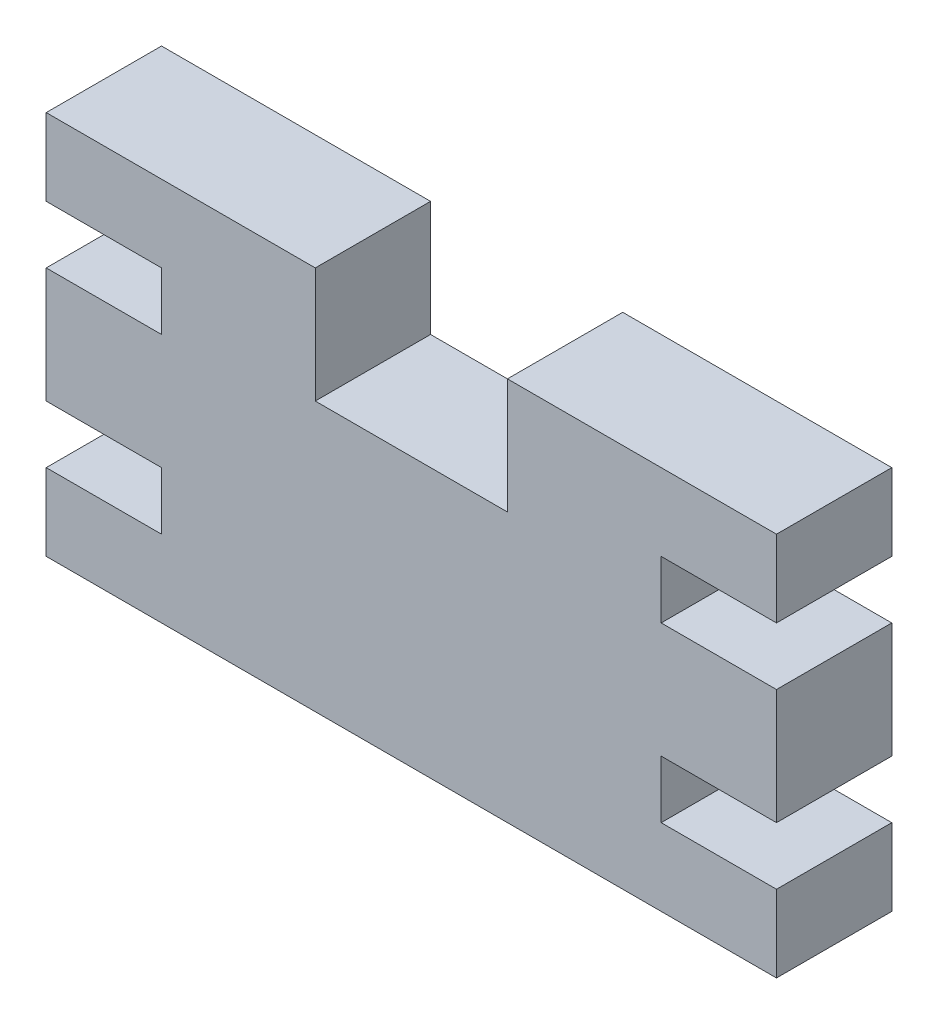
ISO-10303-21;
HEADER;
FILE_DESCRIPTION(('STEP AP214'),'2;1');
FILE_NAME('part.step','',(''),(''),'','','');
FILE_SCHEMA(('AUTOMOTIVE_DESIGN { 1 0 10303 214 1 1 1 1 }'));
ENDSEC;
DATA;
#1=APPLICATION_CONTEXT('core data for automotive mechanical design processes');
#2=APPLICATION_PROTOCOL_DEFINITION('international standard','automotive_design',2000,#1);
#3=PRODUCT_CONTEXT('',#1,'mechanical');
#4=PRODUCT('Part','Part','',(#3));
#5=PRODUCT_RELATED_PRODUCT_CATEGORY('part','',(#4));
#6=PRODUCT_DEFINITION_FORMATION('','',#4);
#7=PRODUCT_DEFINITION_CONTEXT('part definition',#1,'design');
#8=PRODUCT_DEFINITION('design','',#6,#7);
#9=PRODUCT_DEFINITION_SHAPE('','',#8);
#10=(LENGTH_UNIT() NAMED_UNIT(*) SI_UNIT(.MILLI.,.METRE.));
#11=(NAMED_UNIT(*) PLANE_ANGLE_UNIT() SI_UNIT($,.RADIAN.));
#12=(NAMED_UNIT(*) SI_UNIT($,.STERADIAN.) SOLID_ANGLE_UNIT());
#13=UNCERTAINTY_MEASURE_WITH_UNIT(LENGTH_MEASURE(1.E-05),#10,'distance_accuracy_value','');
#14=(GEOMETRIC_REPRESENTATION_CONTEXT(3) GLOBAL_UNCERTAINTY_ASSIGNED_CONTEXT((#13)) GLOBAL_UNIT_ASSIGNED_CONTEXT((#10,
#11,#12)) REPRESENTATION_CONTEXT('',''));
#15=CARTESIAN_POINT('',(0.,0.,0.));
#16=DIRECTION('',(0.,0.,1.));
#17=DIRECTION('',(1.,0.,0.));
#18=AXIS2_PLACEMENT_3D('',#15,#16,#17);
#19=CARTESIAN_POINT('',(12.5,14.6334586466165,3.));
#20=DIRECTION('',(0.,-1.,0.));
#21=DIRECTION('',(0.,0.,-1.));
#22=AXIS2_PLACEMENT_3D('',#19,#20,#21);
#23=PLANE('',#22);
#24=DIRECTION('',(-1.,0.,0.));
#25=VECTOR('',#24,1.);
#26=CARTESIAN_POINT('',(12.5,14.6334586466165,3.));
#27=LINE('',#26,#25);
#28=CARTESIAN_POINT('',(0.499999999999999,14.6334586466165,3.));
#29=VERTEX_POINT('',#28);
#30=CARTESIAN_POINT('',(-6.5,14.6334586466165,3.));
#31=VERTEX_POINT('',#30);
#32=EDGE_CURVE('E349',#29,#31,#27,.T.);
#33=ORIENTED_EDGE('',*,*,#32,.F.);
#34=DIRECTION('',(0.,0.,1.));
#35=VECTOR('',#34,1.);
#36=CARTESIAN_POINT('',(0.499999999999999,14.6334586466165,0.));
#37=LINE('',#36,#35);
#38=CARTESIAN_POINT('',(0.499999999999999,14.6334586466165,0.));
#39=VERTEX_POINT('',#38);
#40=EDGE_CURVE('E229',#39,#29,#37,.T.);
#41=ORIENTED_EDGE('',*,*,#40,.F.);
#42=DIRECTION('',(-1.,0.,0.));
#43=VECTOR('',#42,1.);
#44=CARTESIAN_POINT('',(12.5,14.6334586466165,0.));
#45=LINE('',#44,#43);
#46=CARTESIAN_POINT('',(-6.5,14.6334586466165,0.));
#47=VERTEX_POINT('',#46);
#48=EDGE_CURVE('E220',#39,#47,#45,.T.);
#49=ORIENTED_EDGE('',*,*,#48,.T.);
#50=DIRECTION('',(0.,0.,-1.));
#51=VECTOR('',#50,1.);
#52=CARTESIAN_POINT('',(-6.5,14.6334586466165,3.));
#53=LINE('',#52,#51);
#54=EDGE_CURVE('E354',#31,#47,#53,.T.);
#55=ORIENTED_EDGE('',*,*,#54,.F.);
#56=EDGE_LOOP('',(#33,#41,#49,#55));
#57=FACE_BOUND('',#56,.T.);
#58=ADVANCED_FACE('F39',(#57),#23,.F.);
#59=CARTESIAN_POINT('',(12.5,4.63345864661654,3.));
#60=DIRECTION('',(-1.,0.,0.));
#61=DIRECTION('',(0.,-1.,0.));
#62=AXIS2_PLACEMENT_3D('',#59,#60,#61);
#63=PLANE('',#62);
#64=DIRECTION('',(0.,1.,0.));
#65=VECTOR('',#64,1.);
#66=CARTESIAN_POINT('',(12.5,4.63345864661654,0.));
#67=LINE('',#66,#65);
#68=CARTESIAN_POINT('',(12.5,8.13345864661654,0.));
#69=VERTEX_POINT('',#68);
#70=CARTESIAN_POINT('',(12.5,11.1334586466165,0.));
#71=VERTEX_POINT('',#70);
#72=EDGE_CURVE('E365',#69,#71,#67,.T.);
#73=ORIENTED_EDGE('',*,*,#72,.T.);
#74=DIRECTION('',(0.,0.,1.));
#75=VECTOR('',#74,1.);
#76=CARTESIAN_POINT('',(12.5,11.1334586466165,0.));
#77=LINE('',#76,#75);
#78=CARTESIAN_POINT('',(12.5,11.1334586466165,3.));
#79=VERTEX_POINT('',#78);
#80=EDGE_CURVE('E253',#71,#79,#77,.T.);
#81=ORIENTED_EDGE('',*,*,#80,.T.);
#82=DIRECTION('',(0.,1.,0.));
#83=VECTOR('',#82,1.);
#84=CARTESIAN_POINT('',(12.5,4.63345864661654,3.));
#85=LINE('',#84,#83);
#86=CARTESIAN_POINT('',(12.5,8.13345864661654,3.));
#87=VERTEX_POINT('',#86);
#88=EDGE_CURVE('E350',#87,#79,#85,.T.);
#89=ORIENTED_EDGE('',*,*,#88,.F.);
#90=DIRECTION('',(0.,0.,1.));
#91=VECTOR('',#90,1.);
#92=CARTESIAN_POINT('',(12.5,8.13345864661654,0.));
#93=LINE('',#92,#91);
#94=EDGE_CURVE('E262',#69,#87,#93,.T.);
#95=ORIENTED_EDGE('',*,*,#94,.F.);
#96=EDGE_LOOP('',(#73,#81,#89,#95));
#97=FACE_BOUND('',#96,.T.);
#98=ADVANCED_FACE('F438',(#97),#63,.F.);
#99=CARTESIAN_POINT('',(12.5,4.63345864661654,0.));
#100=VERTEX_POINT('',#99);
#101=CARTESIAN_POINT('',(12.5,6.63345864661654,0.));
#102=VERTEX_POINT('',#101);
#103=EDGE_CURVE('E362',#100,#102,#67,.T.);
#104=ORIENTED_EDGE('',*,*,#103,.T.);
#105=DIRECTION('',(0.,0.,1.));
#106=VECTOR('',#105,1.);
#107=CARTESIAN_POINT('',(12.5,6.63345864661654,0.));
#108=LINE('',#107,#106);
#109=CARTESIAN_POINT('',(12.5,6.63345864661654,3.));
#110=VERTEX_POINT('',#109);
#111=EDGE_CURVE('E231',#102,#110,#108,.T.);
#112=ORIENTED_EDGE('',*,*,#111,.T.);
#113=CARTESIAN_POINT('',(12.5,4.63345864661654,3.));
#114=VERTEX_POINT('',#113);
#115=EDGE_CURVE('E346',#114,#110,#85,.T.);
#116=ORIENTED_EDGE('',*,*,#115,.F.);
#117=DIRECTION('',(0.,0.,-1.));
#118=VECTOR('',#117,1.);
#119=CARTESIAN_POINT('',(12.5,4.63345864661654,3.));
#120=LINE('',#119,#118);
#121=EDGE_CURVE('E47',#114,#100,#120,.T.);
#122=ORIENTED_EDGE('',*,*,#121,.T.);
#123=EDGE_LOOP('',(#104,#112,#116,#122));
#124=FACE_BOUND('',#123,.T.);
#125=ADVANCED_FACE('F378',(#124),#63,.F.);
#126=CARTESIAN_POINT('',(-6.5,4.63345864661654,3.));
#127=DIRECTION('',(1.,0.,0.));
#128=DIRECTION('',(0.,0.,-1.));
#129=AXIS2_PLACEMENT_3D('',#126,#127,#128);
#130=PLANE('',#129);
#131=DIRECTION('',(0.,-1.,0.));
#132=VECTOR('',#131,1.);
#133=CARTESIAN_POINT('',(-6.5,4.63345864661654,0.));
#134=LINE('',#133,#132);
#135=CARTESIAN_POINT('',(-6.5,12.6334586466165,0.));
#136=VERTEX_POINT('',#135);
#137=EDGE_CURVE('E355',#47,#136,#134,.T.);
#138=ORIENTED_EDGE('',*,*,#137,.T.);
#139=DIRECTION('',(0.,0.,1.));
#140=VECTOR('',#139,1.);
#141=CARTESIAN_POINT('',(-6.5,12.6334586466165,0.));
#142=LINE('',#141,#140);
#143=CARTESIAN_POINT('',(-6.5,12.6334586466165,3.));
#144=VERTEX_POINT('',#143);
#145=EDGE_CURVE('E305',#136,#144,#142,.T.);
#146=ORIENTED_EDGE('',*,*,#145,.T.);
#147=DIRECTION('',(0.,-1.,0.));
#148=VECTOR('',#147,1.);
#149=CARTESIAN_POINT('',(-6.5,4.63345864661654,3.));
#150=LINE('',#149,#148);
#151=EDGE_CURVE('E338',#31,#144,#150,.T.);
#152=ORIENTED_EDGE('',*,*,#151,.F.);
#153=ORIENTED_EDGE('',*,*,#54,.T.);
#154=EDGE_LOOP('',(#138,#146,#152,#153));
#155=FACE_BOUND('',#154,.T.);
#156=ADVANCED_FACE('F419',(#155),#130,.F.);
#157=CARTESIAN_POINT('',(-6.5,11.1334586466165,3.));
#158=VERTEX_POINT('',#157);
#159=CARTESIAN_POINT('',(-6.5,8.13345864661654,3.));
#160=VERTEX_POINT('',#159);
#161=EDGE_CURVE('E342',#158,#160,#150,.T.);
#162=ORIENTED_EDGE('',*,*,#161,.F.);
#163=DIRECTION('',(0.,0.,1.));
#164=VECTOR('',#163,1.);
#165=CARTESIAN_POINT('',(-6.5,11.1334586466165,0.));
#166=LINE('',#165,#164);
#167=CARTESIAN_POINT('',(-6.5,11.1334586466165,0.));
#168=VERTEX_POINT('',#167);
#169=EDGE_CURVE('E296',#168,#158,#166,.T.);
#170=ORIENTED_EDGE('',*,*,#169,.F.);
#171=CARTESIAN_POINT('',(-6.5,8.13345864661654,0.));
#172=VERTEX_POINT('',#171);
#173=EDGE_CURVE('E359',#168,#172,#134,.T.);
#174=ORIENTED_EDGE('',*,*,#173,.T.);
#175=DIRECTION('',(0.,0.,1.));
#176=VECTOR('',#175,1.);
#177=CARTESIAN_POINT('',(-6.5,8.13345864661654,0.));
#178=LINE('',#177,#176);
#179=EDGE_CURVE('E256',#172,#160,#178,.T.);
#180=ORIENTED_EDGE('',*,*,#179,.T.);
#181=EDGE_LOOP('',(#162,#170,#174,#180));
#182=FACE_BOUND('',#181,.T.);
#183=ADVANCED_FACE('F401',(#182),#130,.F.);
#184=CARTESIAN_POINT('',(-6.5,6.63345864661654,3.));
#185=VERTEX_POINT('',#184);
#186=CARTESIAN_POINT('',(-6.5,4.63345864661654,3.));
#187=VERTEX_POINT('',#186);
#188=EDGE_CURVE('E343',#185,#187,#150,.T.);
#189=ORIENTED_EDGE('',*,*,#188,.F.);
#190=DIRECTION('',(0.,0.,1.));
#191=VECTOR('',#190,1.);
#192=CARTESIAN_POINT('',(-6.5,6.63345864661654,0.));
#193=LINE('',#192,#191);
#194=CARTESIAN_POINT('',(-6.5,6.63345864661654,0.));
#195=VERTEX_POINT('',#194);
#196=EDGE_CURVE('E314',#195,#185,#193,.T.);
#197=ORIENTED_EDGE('',*,*,#196,.F.);
#198=CARTESIAN_POINT('',(-6.5,4.63345864661654,0.));
#199=VERTEX_POINT('',#198);
#200=EDGE_CURVE('E308',#195,#199,#134,.T.);
#201=ORIENTED_EDGE('',*,*,#200,.T.);
#202=DIRECTION('',(0.,0.,-1.));
#203=VECTOR('',#202,1.);
#204=CARTESIAN_POINT('',(-6.5,4.63345864661654,3.));
#205=LINE('',#204,#203);
#206=EDGE_CURVE('E11',#187,#199,#205,.T.);
#207=ORIENTED_EDGE('',*,*,#206,.F.);
#208=EDGE_LOOP('',(#189,#197,#201,#207));
#209=FACE_BOUND('',#208,.T.);
#210=ADVANCED_FACE('F41',(#209),#130,.F.);
#211=CARTESIAN_POINT('',(12.5,4.63345864661654,3.));
#212=DIRECTION('',(0.,1.,0.));
#213=DIRECTION('',(-1.,0.,0.));
#214=AXIS2_PLACEMENT_3D('',#211,#212,#213);
#215=PLANE('',#214);
#216=DIRECTION('',(1.,0.,0.));
#217=VECTOR('',#216,1.);
#218=CARTESIAN_POINT('',(12.5,4.63345864661654,0.));
#219=LINE('',#218,#217);
#220=EDGE_CURVE('E358',#199,#100,#219,.T.);
#221=ORIENTED_EDGE('',*,*,#220,.T.);
#222=ORIENTED_EDGE('',*,*,#121,.F.);
#223=DIRECTION('',(1.,0.,0.));
#224=VECTOR('',#223,1.);
#225=CARTESIAN_POINT('',(12.5,4.63345864661654,3.));
#226=LINE('',#225,#224);
#227=EDGE_CURVE('E341',#187,#114,#226,.T.);
#228=ORIENTED_EDGE('',*,*,#227,.F.);
#229=ORIENTED_EDGE('',*,*,#206,.T.);
#230=EDGE_LOOP('',(#221,#222,#228,#229));
#231=FACE_BOUND('',#230,.T.);
#232=ADVANCED_FACE('F393',(#231),#215,.F.);
#233=CARTESIAN_POINT('',(12.5,12.6334586466165,3.));
#234=VERTEX_POINT('',#233);
#235=CARTESIAN_POINT('',(12.5,14.6334586466165,3.));
#236=VERTEX_POINT('',#235);
#237=EDGE_CURVE('E345',#234,#236,#85,.T.);
#238=ORIENTED_EDGE('',*,*,#237,.F.);
#239=DIRECTION('',(0.,0.,1.));
#240=VECTOR('',#239,1.);
#241=CARTESIAN_POINT('',(12.5,12.6334586466165,0.));
#242=LINE('',#241,#240);
#243=CARTESIAN_POINT('',(12.5,12.6334586466165,0.));
#244=VERTEX_POINT('',#243);
#245=EDGE_CURVE('E244',#244,#234,#242,.T.);
#246=ORIENTED_EDGE('',*,*,#245,.F.);
#247=CARTESIAN_POINT('',(12.5,14.6334586466165,0.));
#248=VERTEX_POINT('',#247);
#249=EDGE_CURVE('E361',#244,#248,#67,.T.);
#250=ORIENTED_EDGE('',*,*,#249,.T.);
#251=DIRECTION('',(0.,0.,-1.));
#252=VECTOR('',#251,1.);
#253=CARTESIAN_POINT('',(12.5,14.6334586466165,3.));
#254=LINE('',#253,#252);
#255=EDGE_CURVE('E371',#236,#248,#254,.T.);
#256=ORIENTED_EDGE('',*,*,#255,.F.);
#257=EDGE_LOOP('',(#238,#246,#250,#256));
#258=FACE_BOUND('',#257,.T.);
#259=ADVANCED_FACE('F449',(#258),#63,.F.);
#260=CARTESIAN_POINT('',(5.5,14.6334586466165,0.));
#261=VERTEX_POINT('',#260);
#262=EDGE_CURVE('E366',#248,#261,#45,.T.);
#263=ORIENTED_EDGE('',*,*,#262,.T.);
#264=DIRECTION('',(0.,0.,1.));
#265=VECTOR('',#264,1.);
#266=CARTESIAN_POINT('',(5.5,14.6334586466165,0.));
#267=LINE('',#266,#265);
#268=CARTESIAN_POINT('',(5.5,14.6334586466165,3.));
#269=VERTEX_POINT('',#268);
#270=EDGE_CURVE('E232',#261,#269,#267,.T.);
#271=ORIENTED_EDGE('',*,*,#270,.T.);
#272=EDGE_CURVE('E351',#236,#269,#27,.T.);
#273=ORIENTED_EDGE('',*,*,#272,.F.);
#274=ORIENTED_EDGE('',*,*,#255,.T.);
#275=EDGE_LOOP('',(#263,#271,#273,#274));
#276=FACE_BOUND('',#275,.T.);
#277=ADVANCED_FACE('F428',(#276),#23,.F.);
#278=CARTESIAN_POINT('',(0.,0.,3.));
#279=DIRECTION('',(0.,0.,1.));
#280=DIRECTION('',(1.,0.,0.));
#281=AXIS2_PLACEMENT_3D('',#278,#279,#280);
#282=PLANE('',#281);
#283=DIRECTION('',(0.,-1.,0.));
#284=VECTOR('',#283,1.);
#285=CARTESIAN_POINT('',(0.499999999999999,14.6334586466165,3.));
#286=LINE('',#285,#284);
#287=CARTESIAN_POINT('',(0.5,11.6334586466165,3.));
#288=VERTEX_POINT('',#287);
#289=EDGE_CURVE('E206',#29,#288,#286,.T.);
#290=ORIENTED_EDGE('',*,*,#289,.F.);
#291=ORIENTED_EDGE('',*,*,#32,.T.);
#292=ORIENTED_EDGE('',*,*,#151,.T.);
#293=DIRECTION('',(-1.,0.,0.));
#294=VECTOR('',#293,1.);
#295=CARTESIAN_POINT('',(-6.5,12.6334586466165,3.));
#296=LINE('',#295,#294);
#297=CARTESIAN_POINT('',(-3.5,12.6334586466165,3.));
#298=VERTEX_POINT('',#297);
#299=EDGE_CURVE('E290',#298,#144,#296,.T.);
#300=ORIENTED_EDGE('',*,*,#299,.F.);
#301=DIRECTION('',(0.,1.,0.));
#302=VECTOR('',#301,1.);
#303=CARTESIAN_POINT('',(-3.5,12.6334586466165,3.));
#304=LINE('',#303,#302);
#305=CARTESIAN_POINT('',(-3.5,11.1334586466165,3.));
#306=VERTEX_POINT('',#305);
#307=EDGE_CURVE('E300',#306,#298,#304,.T.);
#308=ORIENTED_EDGE('',*,*,#307,.F.);
#309=DIRECTION('',(1.,0.,0.));
#310=VECTOR('',#309,1.);
#311=CARTESIAN_POINT('',(-6.5,11.1334586466165,3.));
#312=LINE('',#311,#310);
#313=EDGE_CURVE('E297',#158,#306,#312,.T.);
#314=ORIENTED_EDGE('',*,*,#313,.F.);
#315=ORIENTED_EDGE('',*,*,#161,.T.);
#316=DIRECTION('',(-1.,0.,0.));
#317=VECTOR('',#316,1.);
#318=CARTESIAN_POINT('',(-6.5,8.13345864661654,3.));
#319=LINE('',#318,#317);
#320=CARTESIAN_POINT('',(-3.5,8.13345864661654,3.));
#321=VERTEX_POINT('',#320);
#322=EDGE_CURVE('E323',#321,#160,#319,.T.);
#323=ORIENTED_EDGE('',*,*,#322,.F.);
#324=DIRECTION('',(0.,1.,0.));
#325=VECTOR('',#324,1.);
#326=CARTESIAN_POINT('',(-3.5,8.13345864661654,3.));
#327=LINE('',#326,#325);
#328=CARTESIAN_POINT('',(-3.5,6.63345864661654,3.));
#329=VERTEX_POINT('',#328);
#330=EDGE_CURVE('E325',#329,#321,#327,.T.);
#331=ORIENTED_EDGE('',*,*,#330,.F.);
#332=DIRECTION('',(1.,0.,0.));
#333=VECTOR('',#332,1.);
#334=CARTESIAN_POINT('',(-6.5,6.63345864661654,3.));
#335=LINE('',#334,#333);
#336=EDGE_CURVE('E301',#185,#329,#335,.T.);
#337=ORIENTED_EDGE('',*,*,#336,.F.);
#338=ORIENTED_EDGE('',*,*,#188,.T.);
#339=ORIENTED_EDGE('',*,*,#227,.T.);
#340=ORIENTED_EDGE('',*,*,#115,.T.);
#341=DIRECTION('',(1.,0.,0.));
#342=VECTOR('',#341,1.);
#343=CARTESIAN_POINT('',(12.5,6.63345864661654,3.));
#344=LINE('',#343,#342);
#345=CARTESIAN_POINT('',(9.5,6.63345864661654,3.));
#346=VERTEX_POINT('',#345);
#347=EDGE_CURVE('E271',#346,#110,#344,.T.);
#348=ORIENTED_EDGE('',*,*,#347,.F.);
#349=DIRECTION('',(0.,-1.,0.));
#350=VECTOR('',#349,1.);
#351=CARTESIAN_POINT('',(9.5,8.13345864661654,3.));
#352=LINE('',#351,#350);
#353=CARTESIAN_POINT('',(9.5,8.13345864661654,3.));
#354=VERTEX_POINT('',#353);
#355=EDGE_CURVE('E273',#354,#346,#352,.T.);
#356=ORIENTED_EDGE('',*,*,#355,.F.);
#357=DIRECTION('',(-1.,0.,0.));
#358=VECTOR('',#357,1.);
#359=CARTESIAN_POINT('',(12.5,8.13345864661654,3.));
#360=LINE('',#359,#358);
#361=EDGE_CURVE('E249',#87,#354,#360,.T.);
#362=ORIENTED_EDGE('',*,*,#361,.F.);
#363=ORIENTED_EDGE('',*,*,#88,.T.);
#364=DIRECTION('',(1.,0.,0.));
#365=VECTOR('',#364,1.);
#366=CARTESIAN_POINT('',(12.5,11.1334586466165,3.));
#367=LINE('',#366,#365);
#368=CARTESIAN_POINT('',(9.5,11.1334586466165,3.));
#369=VERTEX_POINT('',#368);
#370=EDGE_CURVE('E239',#369,#79,#367,.T.);
#371=ORIENTED_EDGE('',*,*,#370,.F.);
#372=DIRECTION('',(0.,-1.,0.));
#373=VECTOR('',#372,1.);
#374=CARTESIAN_POINT('',(9.5,12.6334586466165,3.));
#375=LINE('',#374,#373);
#376=CARTESIAN_POINT('',(9.5,12.6334586466165,3.));
#377=VERTEX_POINT('',#376);
#378=EDGE_CURVE('E248',#377,#369,#375,.T.);
#379=ORIENTED_EDGE('',*,*,#378,.F.);
#380=DIRECTION('',(-1.,0.,0.));
#381=VECTOR('',#380,1.);
#382=CARTESIAN_POINT('',(12.5,12.6334586466165,3.));
#383=LINE('',#382,#381);
#384=EDGE_CURVE('E245',#234,#377,#383,.T.);
#385=ORIENTED_EDGE('',*,*,#384,.F.);
#386=ORIENTED_EDGE('',*,*,#237,.T.);
#387=ORIENTED_EDGE('',*,*,#272,.T.);
#388=DIRECTION('',(0.,1.,0.));
#389=VECTOR('',#388,1.);
#390=CARTESIAN_POINT('',(5.5,14.6334586466165,3.));
#391=LINE('',#390,#389);
#392=CARTESIAN_POINT('',(5.5,11.6334586466165,3.));
#393=VERTEX_POINT('',#392);
#394=EDGE_CURVE('E221',#393,#269,#391,.T.);
#395=ORIENTED_EDGE('',*,*,#394,.F.);
#396=DIRECTION('',(1.,0.,0.));
#397=VECTOR('',#396,1.);
#398=CARTESIAN_POINT('',(0.5,11.6334586466165,3.));
#399=LINE('',#398,#397);
#400=EDGE_CURVE('E223',#288,#393,#399,.T.);
#401=ORIENTED_EDGE('',*,*,#400,.F.);
#402=EDGE_LOOP('',(#290,#291,#292,#300,#308,#314,#315,#323,#331,#337,#338,#339,#340,#348,#356,
#362,#363,#371,#379,#385,#386,#387,#395,#401));
#403=FACE_BOUND('',#402,.T.);
#404=ADVANCED_FACE('F388',(#403),#282,.T.);
#405=CARTESIAN_POINT('',(0.,0.,0.));
#406=DIRECTION('',(0.,0.,1.));
#407=DIRECTION('',(1.,0.,0.));
#408=AXIS2_PLACEMENT_3D('',#405,#406,#407);
#409=PLANE('',#408);
#410=ORIENTED_EDGE('',*,*,#48,.F.);
#411=DIRECTION('',(0.,-1.,0.));
#412=VECTOR('',#411,1.);
#413=CARTESIAN_POINT('',(0.499999999999999,14.6334586466165,0.));
#414=LINE('',#413,#412);
#415=CARTESIAN_POINT('',(0.5,11.6334586466165,0.));
#416=VERTEX_POINT('',#415);
#417=EDGE_CURVE('E203',#39,#416,#414,.T.);
#418=ORIENTED_EDGE('',*,*,#417,.T.);
#419=DIRECTION('',(1.,0.,0.));
#420=VECTOR('',#419,1.);
#421=CARTESIAN_POINT('',(0.5,11.6334586466165,0.));
#422=LINE('',#421,#420);
#423=CARTESIAN_POINT('',(5.5,11.6334586466165,0.));
#424=VERTEX_POINT('',#423);
#425=EDGE_CURVE('E213',#416,#424,#422,.T.);
#426=ORIENTED_EDGE('',*,*,#425,.T.);
#427=DIRECTION('',(0.,1.,0.));
#428=VECTOR('',#427,1.);
#429=CARTESIAN_POINT('',(5.5,14.6334586466165,0.));
#430=LINE('',#429,#428);
#431=EDGE_CURVE('E54',#424,#261,#430,.T.);
#432=ORIENTED_EDGE('',*,*,#431,.T.);
#433=ORIENTED_EDGE('',*,*,#262,.F.);
#434=ORIENTED_EDGE('',*,*,#249,.F.);
#435=DIRECTION('',(-1.,0.,0.));
#436=VECTOR('',#435,1.);
#437=CARTESIAN_POINT('',(12.5,12.6334586466165,0.));
#438=LINE('',#437,#436);
#439=CARTESIAN_POINT('',(9.5,12.6334586466165,0.));
#440=VERTEX_POINT('',#439);
#441=EDGE_CURVE('E236',#244,#440,#438,.T.);
#442=ORIENTED_EDGE('',*,*,#441,.T.);
#443=DIRECTION('',(0.,-1.,0.));
#444=VECTOR('',#443,1.);
#445=CARTESIAN_POINT('',(9.5,12.6334586466165,0.));
#446=LINE('',#445,#444);
#447=CARTESIAN_POINT('',(9.5,11.1334586466165,0.));
#448=VERTEX_POINT('',#447);
#449=EDGE_CURVE('E62',#440,#448,#446,.T.);
#450=ORIENTED_EDGE('',*,*,#449,.T.);
#451=DIRECTION('',(1.,0.,0.));
#452=VECTOR('',#451,1.);
#453=CARTESIAN_POINT('',(12.5,11.1334586466165,0.));
#454=LINE('',#453,#452);
#455=EDGE_CURVE('E241',#448,#71,#454,.T.);
#456=ORIENTED_EDGE('',*,*,#455,.T.);
#457=ORIENTED_EDGE('',*,*,#72,.F.);
#458=DIRECTION('',(-1.,0.,0.));
#459=VECTOR('',#458,1.);
#460=CARTESIAN_POINT('',(12.5,8.13345864661654,0.));
#461=LINE('',#460,#459);
#462=CARTESIAN_POINT('',(9.5,8.13345864661654,0.));
#463=VERTEX_POINT('',#462);
#464=EDGE_CURVE('E274',#69,#463,#461,.T.);
#465=ORIENTED_EDGE('',*,*,#464,.T.);
#466=DIRECTION('',(0.,-1.,0.));
#467=VECTOR('',#466,1.);
#468=CARTESIAN_POINT('',(9.5,8.13345864661654,0.));
#469=LINE('',#468,#467);
#470=CARTESIAN_POINT('',(9.5,6.63345864661654,0.));
#471=VERTEX_POINT('',#470);
#472=EDGE_CURVE('E281',#463,#471,#469,.T.);
#473=ORIENTED_EDGE('',*,*,#472,.T.);
#474=DIRECTION('',(1.,0.,0.));
#475=VECTOR('',#474,1.);
#476=CARTESIAN_POINT('',(12.5,6.63345864661654,0.));
#477=LINE('',#476,#475);
#478=EDGE_CURVE('E264',#471,#102,#477,.T.);
#479=ORIENTED_EDGE('',*,*,#478,.T.);
#480=ORIENTED_EDGE('',*,*,#103,.F.);
#481=ORIENTED_EDGE('',*,*,#220,.F.);
#482=ORIENTED_EDGE('',*,*,#200,.F.);
#483=DIRECTION('',(1.,0.,0.));
#484=VECTOR('',#483,1.);
#485=CARTESIAN_POINT('',(-6.5,6.63345864661654,0.));
#486=LINE('',#485,#484);
#487=CARTESIAN_POINT('',(-3.5,6.63345864661654,0.));
#488=VERTEX_POINT('',#487);
#489=EDGE_CURVE('E326',#195,#488,#486,.T.);
#490=ORIENTED_EDGE('',*,*,#489,.T.);
#491=DIRECTION('',(0.,1.,0.));
#492=VECTOR('',#491,1.);
#493=CARTESIAN_POINT('',(-3.5,8.13345864661654,0.));
#494=LINE('',#493,#492);
#495=CARTESIAN_POINT('',(-3.5,8.13345864661654,0.));
#496=VERTEX_POINT('',#495);
#497=EDGE_CURVE('E333',#488,#496,#494,.T.);
#498=ORIENTED_EDGE('',*,*,#497,.T.);
#499=DIRECTION('',(-1.,0.,0.));
#500=VECTOR('',#499,1.);
#501=CARTESIAN_POINT('',(-6.5,8.13345864661654,0.));
#502=LINE('',#501,#500);
#503=EDGE_CURVE('E316',#496,#172,#502,.T.);
#504=ORIENTED_EDGE('',*,*,#503,.T.);
#505=ORIENTED_EDGE('',*,*,#173,.F.);
#506=DIRECTION('',(1.,0.,0.));
#507=VECTOR('',#506,1.);
#508=CARTESIAN_POINT('',(-6.5,11.1334586466165,0.));
#509=LINE('',#508,#507);
#510=CARTESIAN_POINT('',(-3.5,11.1334586466165,0.));
#511=VERTEX_POINT('',#510);
#512=EDGE_CURVE('E286',#168,#511,#509,.T.);
#513=ORIENTED_EDGE('',*,*,#512,.T.);
#514=DIRECTION('',(0.,1.,0.));
#515=VECTOR('',#514,1.);
#516=CARTESIAN_POINT('',(-3.5,12.6334586466165,0.));
#517=LINE('',#516,#515);
#518=CARTESIAN_POINT('',(-3.5,12.6334586466165,0.));
#519=VERTEX_POINT('',#518);
#520=EDGE_CURVE('E289',#511,#519,#517,.T.);
#521=ORIENTED_EDGE('',*,*,#520,.T.);
#522=DIRECTION('',(-1.,0.,0.));
#523=VECTOR('',#522,1.);
#524=CARTESIAN_POINT('',(-6.5,12.6334586466165,0.));
#525=LINE('',#524,#523);
#526=EDGE_CURVE('E293',#519,#136,#525,.T.);
#527=ORIENTED_EDGE('',*,*,#526,.T.);
#528=ORIENTED_EDGE('',*,*,#137,.F.);
#529=EDGE_LOOP('',(#410,#418,#426,#432,#433,#434,#442,#450,#456,#457,#465,#473,#479,#480,#481,
#482,#490,#498,#504,#505,#513,#521,#527,#528));
#530=FACE_BOUND('',#529,.T.);
#531=ADVANCED_FACE('F218',(#530),#409,.F.);
#532=CARTESIAN_POINT('',(-6.5,8.13345864661654,0.));
#533=DIRECTION('',(0.,1.,0.));
#534=DIRECTION('',(0.,0.,1.));
#535=AXIS2_PLACEMENT_3D('',#532,#533,#534);
#536=PLANE('',#535);
#537=ORIENTED_EDGE('',*,*,#322,.T.);
#538=ORIENTED_EDGE('',*,*,#179,.F.);
#539=ORIENTED_EDGE('',*,*,#503,.F.);
#540=DIRECTION('',(0.,0.,1.));
#541=VECTOR('',#540,1.);
#542=CARTESIAN_POINT('',(-3.5,8.13345864661654,0.));
#543=LINE('',#542,#541);
#544=EDGE_CURVE('E319',#496,#321,#543,.T.);
#545=ORIENTED_EDGE('',*,*,#544,.T.);
#546=EDGE_LOOP('',(#537,#538,#539,#545));
#547=FACE_BOUND('',#546,.T.);
#548=ADVANCED_FACE('F405',(#547),#536,.F.);
#549=CARTESIAN_POINT('',(-3.5,8.13345864661654,0.));
#550=DIRECTION('',(1.,0.,0.));
#551=DIRECTION('',(0.,1.,0.));
#552=AXIS2_PLACEMENT_3D('',#549,#550,#551);
#553=PLANE('',#552);
#554=ORIENTED_EDGE('',*,*,#330,.T.);
#555=ORIENTED_EDGE('',*,*,#544,.F.);
#556=ORIENTED_EDGE('',*,*,#497,.F.);
#557=DIRECTION('',(0.,0.,1.));
#558=VECTOR('',#557,1.);
#559=CARTESIAN_POINT('',(-3.5,6.63345864661654,0.));
#560=LINE('',#559,#558);
#561=EDGE_CURVE('E317',#488,#329,#560,.T.);
#562=ORIENTED_EDGE('',*,*,#561,.T.);
#563=EDGE_LOOP('',(#554,#555,#556,#562));
#564=FACE_BOUND('',#563,.T.);
#565=ADVANCED_FACE('F471',(#564),#553,.F.);
#566=CARTESIAN_POINT('',(-6.5,6.63345864661654,0.));
#567=DIRECTION('',(0.,-1.,0.));
#568=DIRECTION('',(0.,0.,-1.));
#569=AXIS2_PLACEMENT_3D('',#566,#567,#568);
#570=PLANE('',#569);
#571=ORIENTED_EDGE('',*,*,#336,.T.);
#572=ORIENTED_EDGE('',*,*,#561,.F.);
#573=ORIENTED_EDGE('',*,*,#489,.F.);
#574=ORIENTED_EDGE('',*,*,#196,.T.);
#575=EDGE_LOOP('',(#571,#572,#573,#574));
#576=FACE_BOUND('',#575,.T.);
#577=ADVANCED_FACE('F474',(#576),#570,.F.);
#578=CARTESIAN_POINT('',(-6.5,12.6334586466165,0.));
#579=DIRECTION('',(0.,1.,0.));
#580=DIRECTION('',(0.,0.,1.));
#581=AXIS2_PLACEMENT_3D('',#578,#579,#580);
#582=PLANE('',#581);
#583=ORIENTED_EDGE('',*,*,#299,.T.);
#584=ORIENTED_EDGE('',*,*,#145,.F.);
#585=ORIENTED_EDGE('',*,*,#526,.F.);
#586=DIRECTION('',(0.,0.,1.));
#587=VECTOR('',#586,1.);
#588=CARTESIAN_POINT('',(-3.5,12.6334586466165,0.));
#589=LINE('',#588,#587);
#590=EDGE_CURVE('E309',#519,#298,#589,.T.);
#591=ORIENTED_EDGE('',*,*,#590,.T.);
#592=EDGE_LOOP('',(#583,#584,#585,#591));
#593=FACE_BOUND('',#592,.T.);
#594=ADVANCED_FACE('F478',(#593),#582,.F.);
#595=CARTESIAN_POINT('',(-3.5,12.6334586466165,0.));
#596=DIRECTION('',(1.,0.,0.));
#597=DIRECTION('',(0.,0.,-1.));
#598=AXIS2_PLACEMENT_3D('',#595,#596,#597);
#599=PLANE('',#598);
#600=ORIENTED_EDGE('',*,*,#307,.T.);
#601=ORIENTED_EDGE('',*,*,#590,.F.);
#602=ORIENTED_EDGE('',*,*,#520,.F.);
#603=DIRECTION('',(0.,0.,1.));
#604=VECTOR('',#603,1.);
#605=CARTESIAN_POINT('',(-3.5,11.1334586466165,0.));
#606=LINE('',#605,#604);
#607=EDGE_CURVE('E311',#511,#306,#606,.T.);
#608=ORIENTED_EDGE('',*,*,#607,.T.);
#609=EDGE_LOOP('',(#600,#601,#602,#608));
#610=FACE_BOUND('',#609,.T.);
#611=ADVANCED_FACE('F415',(#610),#599,.F.);
#612=CARTESIAN_POINT('',(-6.5,11.1334586466165,0.));
#613=DIRECTION('',(0.,-1.,0.));
#614=DIRECTION('',(0.,0.,-1.));
#615=AXIS2_PLACEMENT_3D('',#612,#613,#614);
#616=PLANE('',#615);
#617=ORIENTED_EDGE('',*,*,#313,.T.);
#618=ORIENTED_EDGE('',*,*,#607,.F.);
#619=ORIENTED_EDGE('',*,*,#512,.F.);
#620=ORIENTED_EDGE('',*,*,#169,.T.);
#621=EDGE_LOOP('',(#617,#618,#619,#620));
#622=FACE_BOUND('',#621,.T.);
#623=ADVANCED_FACE('F413',(#622),#616,.F.);
#624=CARTESIAN_POINT('',(12.5,6.63345864661654,0.));
#625=DIRECTION('',(0.,-1.,0.));
#626=DIRECTION('',(0.,0.,-1.));
#627=AXIS2_PLACEMENT_3D('',#624,#625,#626);
#628=PLANE('',#627);
#629=ORIENTED_EDGE('',*,*,#347,.T.);
#630=ORIENTED_EDGE('',*,*,#111,.F.);
#631=ORIENTED_EDGE('',*,*,#478,.F.);
#632=DIRECTION('',(0.,0.,1.));
#633=VECTOR('',#632,1.);
#634=CARTESIAN_POINT('',(9.5,6.63345864661654,0.));
#635=LINE('',#634,#633);
#636=EDGE_CURVE('E267',#471,#346,#635,.T.);
#637=ORIENTED_EDGE('',*,*,#636,.T.);
#638=EDGE_LOOP('',(#629,#630,#631,#637));
#639=FACE_BOUND('',#638,.T.);
#640=ADVANCED_FACE('F385',(#639),#628,.F.);
#641=CARTESIAN_POINT('',(9.5,8.13345864661654,0.));
#642=DIRECTION('',(-1.,0.,0.));
#643=DIRECTION('',(0.,0.,1.));
#644=AXIS2_PLACEMENT_3D('',#641,#642,#643);
#645=PLANE('',#644);
#646=ORIENTED_EDGE('',*,*,#355,.T.);
#647=ORIENTED_EDGE('',*,*,#636,.F.);
#648=ORIENTED_EDGE('',*,*,#472,.F.);
#649=DIRECTION('',(0.,0.,1.));
#650=VECTOR('',#649,1.);
#651=CARTESIAN_POINT('',(9.5,8.13345864661654,0.));
#652=LINE('',#651,#650);
#653=EDGE_CURVE('E265',#463,#354,#652,.T.);
#654=ORIENTED_EDGE('',*,*,#653,.T.);
#655=EDGE_LOOP('',(#646,#647,#648,#654));
#656=FACE_BOUND('',#655,.T.);
#657=ADVANCED_FACE('F487',(#656),#645,.F.);
#658=CARTESIAN_POINT('',(12.5,8.13345864661654,0.));
#659=DIRECTION('',(0.,1.,0.));
#660=DIRECTION('',(-1.,0.,0.));
#661=AXIS2_PLACEMENT_3D('',#658,#659,#660);
#662=PLANE('',#661);
#663=ORIENTED_EDGE('',*,*,#361,.T.);
#664=ORIENTED_EDGE('',*,*,#653,.F.);
#665=ORIENTED_EDGE('',*,*,#464,.F.);
#666=ORIENTED_EDGE('',*,*,#94,.T.);
#667=EDGE_LOOP('',(#663,#664,#665,#666));
#668=FACE_BOUND('',#667,.T.);
#669=ADVANCED_FACE('F490',(#668),#662,.F.);
#670=CARTESIAN_POINT('',(12.5,11.1334586466165,0.));
#671=DIRECTION('',(0.,-1.,0.));
#672=DIRECTION('',(1.,0.,0.));
#673=AXIS2_PLACEMENT_3D('',#670,#671,#672);
#674=PLANE('',#673);
#675=ORIENTED_EDGE('',*,*,#370,.T.);
#676=ORIENTED_EDGE('',*,*,#80,.F.);
#677=ORIENTED_EDGE('',*,*,#455,.F.);
#678=DIRECTION('',(0.,0.,1.));
#679=VECTOR('',#678,1.);
#680=CARTESIAN_POINT('',(9.5,11.1334586466165,0.));
#681=LINE('',#680,#679);
#682=EDGE_CURVE('E257',#448,#369,#681,.T.);
#683=ORIENTED_EDGE('',*,*,#682,.T.);
#684=EDGE_LOOP('',(#675,#676,#677,#683));
#685=FACE_BOUND('',#684,.T.);
#686=ADVANCED_FACE('F443',(#685),#674,.F.);
#687=CARTESIAN_POINT('',(9.5,12.6334586466165,0.));
#688=DIRECTION('',(-1.,0.,0.));
#689=DIRECTION('',(0.,0.,1.));
#690=AXIS2_PLACEMENT_3D('',#687,#688,#689);
#691=PLANE('',#690);
#692=ORIENTED_EDGE('',*,*,#378,.T.);
#693=ORIENTED_EDGE('',*,*,#682,.F.);
#694=ORIENTED_EDGE('',*,*,#449,.F.);
#695=DIRECTION('',(0.,0.,1.));
#696=VECTOR('',#695,1.);
#697=CARTESIAN_POINT('',(9.5,12.6334586466165,0.));
#698=LINE('',#697,#696);
#699=EDGE_CURVE('E259',#440,#377,#698,.T.);
#700=ORIENTED_EDGE('',*,*,#699,.T.);
#701=EDGE_LOOP('',(#692,#693,#694,#700));
#702=FACE_BOUND('',#701,.T.);
#703=ADVANCED_FACE('F497',(#702),#691,.F.);
#704=CARTESIAN_POINT('',(12.5,12.6334586466165,0.));
#705=DIRECTION('',(0.,1.,0.));
#706=DIRECTION('',(0.,0.,1.));
#707=AXIS2_PLACEMENT_3D('',#704,#705,#706);
#708=PLANE('',#707);
#709=ORIENTED_EDGE('',*,*,#384,.T.);
#710=ORIENTED_EDGE('',*,*,#699,.F.);
#711=ORIENTED_EDGE('',*,*,#441,.F.);
#712=ORIENTED_EDGE('',*,*,#245,.T.);
#713=EDGE_LOOP('',(#709,#710,#711,#712));
#714=FACE_BOUND('',#713,.T.);
#715=ADVANCED_FACE('F495',(#714),#708,.F.);
#716=CARTESIAN_POINT('',(0.499999999999999,14.6334586466165,0.));
#717=DIRECTION('',(-1.,0.,0.));
#718=DIRECTION('',(0.,-1.,0.));
#719=AXIS2_PLACEMENT_3D('',#716,#717,#718);
#720=PLANE('',#719);
#721=ORIENTED_EDGE('',*,*,#289,.T.);
#722=DIRECTION('',(0.,0.,1.));
#723=VECTOR('',#722,1.);
#724=CARTESIAN_POINT('',(0.5,11.6334586466165,0.));
#725=LINE('',#724,#723);
#726=EDGE_CURVE('E199',#416,#288,#725,.T.);
#727=ORIENTED_EDGE('',*,*,#726,.F.);
#728=ORIENTED_EDGE('',*,*,#417,.F.);
#729=ORIENTED_EDGE('',*,*,#40,.T.);
#730=EDGE_LOOP('',(#721,#727,#728,#729));
#731=FACE_BOUND('',#730,.T.);
#732=ADVANCED_FACE('F201',(#731),#720,.F.);
#733=CARTESIAN_POINT('',(5.5,14.6334586466165,0.));
#734=DIRECTION('',(1.,0.,0.));
#735=DIRECTION('',(0.,1.,0.));
#736=AXIS2_PLACEMENT_3D('',#733,#734,#735);
#737=PLANE('',#736);
#738=ORIENTED_EDGE('',*,*,#394,.T.);
#739=ORIENTED_EDGE('',*,*,#270,.F.);
#740=ORIENTED_EDGE('',*,*,#431,.F.);
#741=DIRECTION('',(0.,0.,1.));
#742=VECTOR('',#741,1.);
#743=CARTESIAN_POINT('',(5.5,11.6334586466165,0.));
#744=LINE('',#743,#742);
#745=EDGE_CURVE('E210',#424,#393,#744,.T.);
#746=ORIENTED_EDGE('',*,*,#745,.T.);
#747=EDGE_LOOP('',(#738,#739,#740,#746));
#748=FACE_BOUND('',#747,.T.);
#749=ADVANCED_FACE('F426',(#748),#737,.F.);
#750=CARTESIAN_POINT('',(0.5,11.6334586466165,0.));
#751=DIRECTION('',(0.,-1.,0.));
#752=DIRECTION('',(0.,0.,-1.));
#753=AXIS2_PLACEMENT_3D('',#750,#751,#752);
#754=PLANE('',#753);
#755=ORIENTED_EDGE('',*,*,#400,.T.);
#756=ORIENTED_EDGE('',*,*,#745,.F.);
#757=ORIENTED_EDGE('',*,*,#425,.F.);
#758=ORIENTED_EDGE('',*,*,#726,.T.);
#759=EDGE_LOOP('',(#755,#756,#757,#758));
#760=FACE_BOUND('',#759,.T.);
#761=ADVANCED_FACE('F214',(#760),#754,.F.);
#762=CLOSED_SHELL('',(#58,#98,#125,#156,#183,#210,#232,#259,#277,#404,#531,#548,#565,#577,#594,
#611,#623,#640,#657,#669,#686,#703,#715,#732,#749,#761));
#763=MANIFOLD_SOLID_BREP('B2',#762);
#764=ADVANCED_BREP_SHAPE_REPRESENTATION('',(#18,#763),#14);
#765=SHAPE_DEFINITION_REPRESENTATION(#9,#764);
ENDSEC;
END-ISO-10303-21;
